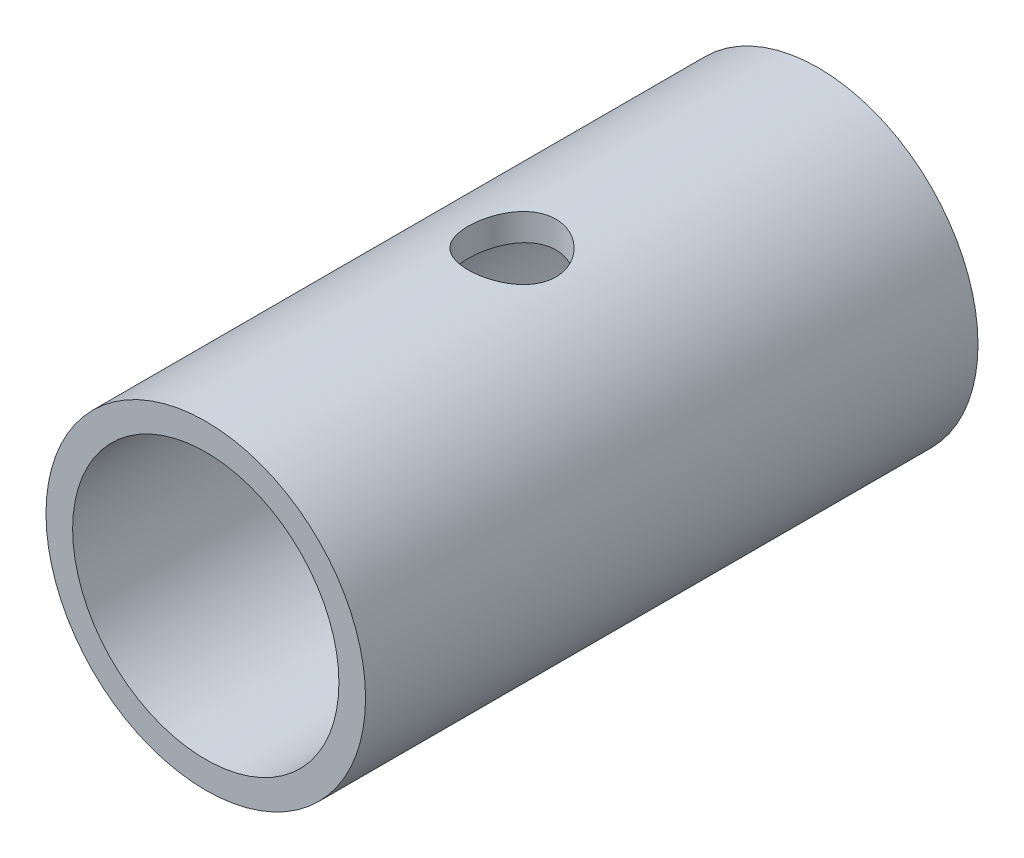
ISO-10303-21;
HEADER;
FILE_DESCRIPTION(('STEP AP214'),'2;1');
FILE_NAME('part.step','',(''),(''),'','','');
FILE_SCHEMA(('AUTOMOTIVE_DESIGN { 1 0 10303 214 1 1 1 1 }'));
ENDSEC;
DATA;
#1=APPLICATION_CONTEXT('core data for automotive mechanical design processes');
#2=APPLICATION_PROTOCOL_DEFINITION('international standard','automotive_design',2000,#1);
#3=PRODUCT_CONTEXT('',#1,'mechanical');
#4=PRODUCT('Part','Part','',(#3));
#5=PRODUCT_RELATED_PRODUCT_CATEGORY('part','',(#4));
#6=PRODUCT_DEFINITION_FORMATION('','',#4);
#7=PRODUCT_DEFINITION_CONTEXT('part definition',#1,'design');
#8=PRODUCT_DEFINITION('design','',#6,#7);
#9=PRODUCT_DEFINITION_SHAPE('','',#8);
#10=(LENGTH_UNIT() NAMED_UNIT(*) SI_UNIT(.MILLI.,.METRE.));
#11=(NAMED_UNIT(*) PLANE_ANGLE_UNIT() SI_UNIT($,.RADIAN.));
#12=(NAMED_UNIT(*) SI_UNIT($,.STERADIAN.) SOLID_ANGLE_UNIT());
#13=UNCERTAINTY_MEASURE_WITH_UNIT(LENGTH_MEASURE(1.E-05),#10,'distance_accuracy_value','');
#14=(GEOMETRIC_REPRESENTATION_CONTEXT(3) GLOBAL_UNCERTAINTY_ASSIGNED_CONTEXT((#13)) GLOBAL_UNIT_ASSIGNED_CONTEXT((#10,
#11,#12)) REPRESENTATION_CONTEXT('',''));
#15=CARTESIAN_POINT('',(0.,0.,0.));
#16=DIRECTION('',(0.,0.,1.));
#17=DIRECTION('',(1.,0.,0.));
#18=AXIS2_PLACEMENT_3D('',#15,#16,#17);
#19=CARTESIAN_POINT('',(0.,0.,11.5));
#20=DIRECTION('',(0.,0.,1.));
#21=DIRECTION('',(1.,0.,0.));
#22=AXIS2_PLACEMENT_3D('',#19,#20,#21);
#23=PLANE('',#22);
#24=CARTESIAN_POINT('',(0.,0.,11.5));
#25=DIRECTION('',(0.,0.,1.));
#26=DIRECTION('',(1.,0.,0.));
#27=AXIS2_PLACEMENT_3D('',#24,#25,#26);
#28=CIRCLE('',#27,6.);
#29=CARTESIAN_POINT('',(6.,0.,11.5));
#30=VERTEX_POINT('',#29);
#31=EDGE_CURVE('E10',#30,#30,#28,.T.);
#32=ORIENTED_EDGE('',*,*,#31,.T.);
#33=EDGE_LOOP('',(#32));
#34=FACE_BOUND('',#33,.T.);
#35=CARTESIAN_POINT('',(0.,0.,11.5));
#36=DIRECTION('',(0.,0.,1.));
#37=DIRECTION('',(1.,0.,0.));
#38=AXIS2_PLACEMENT_3D('',#35,#36,#37);
#39=CIRCLE('',#38,5.);
#40=CARTESIAN_POINT('',(5.,0.,11.5));
#41=VERTEX_POINT('',#40);
#42=EDGE_CURVE('E45',#41,#41,#39,.T.);
#43=ORIENTED_EDGE('',*,*,#42,.F.);
#44=EDGE_LOOP('',(#43));
#45=FACE_BOUND('',#44,.T.);
#46=ADVANCED_FACE('F34',(#34,#45),#23,.T.);
#47=CARTESIAN_POINT('',(0.,0.,-11.5));
#48=DIRECTION('',(0.,0.,1.));
#49=DIRECTION('',(1.,0.,0.));
#50=AXIS2_PLACEMENT_3D('',#47,#48,#49);
#51=PLANE('',#50);
#52=CARTESIAN_POINT('',(0.,0.,-11.5));
#53=DIRECTION('',(0.,0.,1.));
#54=DIRECTION('',(1.,0.,0.));
#55=AXIS2_PLACEMENT_3D('',#52,#53,#54);
#56=CIRCLE('',#55,6.);
#57=CARTESIAN_POINT('',(6.,0.,-11.5));
#58=VERTEX_POINT('',#57);
#59=EDGE_CURVE('E38',#58,#58,#56,.T.);
#60=ORIENTED_EDGE('',*,*,#59,.F.);
#61=EDGE_LOOP('',(#60));
#62=FACE_BOUND('',#61,.T.);
#63=CARTESIAN_POINT('',(0.,0.,-11.5));
#64=DIRECTION('',(0.,0.,1.));
#65=DIRECTION('',(1.,0.,0.));
#66=AXIS2_PLACEMENT_3D('',#63,#64,#65);
#67=CIRCLE('',#66,5.);
#68=CARTESIAN_POINT('',(5.,0.,-11.5));
#69=VERTEX_POINT('',#68);
#70=EDGE_CURVE('E47',#69,#69,#67,.T.);
#71=ORIENTED_EDGE('',*,*,#70,.T.);
#72=EDGE_LOOP('',(#71));
#73=FACE_BOUND('',#72,.T.);
#74=ADVANCED_FACE('F78',(#62,#73),#51,.F.);
#75=CARTESIAN_POINT('',(0.,0.,11.5));
#76=DIRECTION('',(0.,0.,-1.));
#77=DIRECTION('',(-1.,0.,0.));
#78=AXIS2_PLACEMENT_3D('',#75,#76,#77);
#79=CYLINDRICAL_SURFACE('',#78,6.);
#80=CARTESIAN_POINT('',(0.,6.,1.65));
#81=CARTESIAN_POINT('',(0.090853728327696,5.99999874308259,1.64999807099645));
#82=CARTESIAN_POINT('',(0.181727733575568,5.99791622790463,1.64247089912752));
#83=CARTESIAN_POINT('',(0.360851012556402,5.98981117624032,1.61261870180666));
#84=CARTESIAN_POINT('',(0.449099121993647,5.98378691845858,1.59028721149158));
#85=CARTESIAN_POINT('',(0.620359675500261,5.96846215356675,1.5316125135351));
#86=CARTESIAN_POINT('',(0.703378936424506,5.95916602079348,1.49528800777301));
#87=CARTESIAN_POINT('',(0.862147532275073,5.9382760100701,1.40972952683832));
#88=CARTESIAN_POINT('',(0.937896261330002,5.92668194087358,1.36049447707183));
#89=CARTESIAN_POINT('',(1.08183136781088,5.90212624569014,1.2492381199734));
#90=CARTESIAN_POINT('',(1.14981405351217,5.88914009329631,1.18695870420413));
#91=CARTESIAN_POINT('',(1.27451362220699,5.86341857808967,1.05193283429949));
#92=CARTESIAN_POINT('',(1.33122895521962,5.85068324999801,0.979184942450014));
#93=CARTESIAN_POINT('',(1.43279568288042,5.82665244921014,0.823638002819942));
#94=CARTESIAN_POINT('',(1.47740934109683,5.81538781414375,0.740678517304746));
#95=CARTESIAN_POINT('',(1.55197373568299,5.79593589094513,0.568075919513222));
#96=CARTESIAN_POINT('',(1.58192736761612,5.78774799518745,0.478434131120398));
#97=CARTESIAN_POINT('',(1.62560750003859,5.7756304093822,0.297275336240546));
#98=CARTESIAN_POINT('',(1.63970484886952,5.77160359132479,0.205854405766726));
#99=CARTESIAN_POINT('',(1.65242890666582,5.76797418839314,0.0218632638827159));
#100=CARTESIAN_POINT('',(1.65105870633264,5.76837071965198,-0.0707067142339519));
#101=CARTESIAN_POINT('',(1.63318021863208,5.77345648215431,-0.251445448718453));
#102=CARTESIAN_POINT('',(1.61712435820282,5.77801741181752,-0.339663148670662));
#103=CARTESIAN_POINT('',(1.57105645702899,5.79071212543296,-0.5121015428571));
#104=CARTESIAN_POINT('',(1.54104323793963,5.79884621104432,-0.596321898955338));
#105=CARTESIAN_POINT('',(1.46755257403608,5.8178810068791,-0.759536646499854));
#106=CARTESIAN_POINT('',(1.42391940277051,5.82881343808644,-0.838457062932246));
#107=CARTESIAN_POINT('',(1.32453594216562,5.8521965018176,-0.988013089670044));
#108=CARTESIAN_POINT('',(1.26878313205863,5.86464744994142,-1.05864697174372));
#109=CARTESIAN_POINT('',(1.14444557863618,5.89019543667637,-1.19220548799731));
#110=CARTESIAN_POINT('',(1.07548193780207,5.90329988395932,-1.25477649008794));
#111=CARTESIAN_POINT('',(0.927879174135835,5.92829105959038,-1.36754009171226));
#112=CARTESIAN_POINT('',(0.849239620758374,5.94017773370855,-1.41773214012565));
#113=CARTESIAN_POINT('',(0.683947027422496,5.96147504122309,-1.50448258165223));
#114=CARTESIAN_POINT('',(0.597256901414118,5.97087336103955,-1.54097353369754));
#115=CARTESIAN_POINT('',(0.418654132043705,5.98604617450553,-1.59875969929591));
#116=CARTESIAN_POINT('',(0.326742710235057,5.9918215119967,-1.62005845147649));
#117=CARTESIAN_POINT('',(0.143321506269139,5.99896860669685,-1.64629239149309));
#118=CARTESIAN_POINT('',(0.0518853661978224,6.00046960488126,-1.65170798633319));
#119=CARTESIAN_POINT('',(-0.13058988459751,5.99927229231555,-1.64735333458747));
#120=CARTESIAN_POINT('',(-0.221629038059,5.9965744453723,-1.63758476525333));
#121=CARTESIAN_POINT('',(-0.398987770207998,5.98736635921293,-1.60353193851751));
#122=CARTESIAN_POINT('',(-0.485363423879031,5.98092734475059,-1.57951869821485));
#123=CARTESIAN_POINT('',(-0.652849667611911,5.96497031766694,-1.51797560507925));
#124=CARTESIAN_POINT('',(-0.733959668311753,5.95545196109898,-1.48044424228852));
#125=CARTESIAN_POINT('',(-0.890455295917684,5.93409297712807,-1.39205978335043));
#126=CARTESIAN_POINT('',(-0.965689503643772,5.92220874688328,-1.34094938630763));
#127=CARTESIAN_POINT('',(-1.1066809671127,5.89749009177705,-1.2271784596786));
#128=CARTESIAN_POINT('',(-1.17243622308682,5.88465546727348,-1.16451549919106));
#129=CARTESIAN_POINT('',(-1.29465015721015,5.85900191245662,-1.02717154749665));
#130=CARTESIAN_POINT('',(-1.35076903800646,5.84619510636324,-0.952185340929553));
#131=CARTESIAN_POINT('',(-1.44963820489912,5.82246888214058,-0.793586486663871));
#132=CARTESIAN_POINT('',(-1.49238901579837,5.81154938992678,-0.709974177779731));
#133=CARTESIAN_POINT('',(-1.56298916810733,5.79296111659894,-0.536887669815469));
#134=CARTESIAN_POINT('',(-1.59092227269253,5.78527411484172,-0.447449701169388));
#135=CARTESIAN_POINT('',(-1.63127619202049,5.77402677636451,-0.264896462537506));
#136=CARTESIAN_POINT('',(-1.64370128166884,5.77046530242998,-0.171782213251764));
#137=CARTESIAN_POINT('',(-1.65242931750206,5.76797147491958,0.0119898828132407));
#138=CARTESIAN_POINT('',(-1.64928014369359,5.76888180213839,0.102619950855172));
#139=CARTESIAN_POINT('',(-1.62822879843177,5.77485828369776,0.282003416000701));
#140=CARTESIAN_POINT('',(-1.61032705344815,5.77992431790445,0.370756867277771));
#141=CARTESIAN_POINT('',(-1.56060549557288,5.7935447800639,0.543128977348241));
#142=CARTESIAN_POINT('',(-1.52890872620598,5.80206832439478,0.626785742657211));
#143=CARTESIAN_POINT('',(-1.45259209961126,5.82164247853969,0.78765860998809));
#144=CARTESIAN_POINT('',(-1.40797010013714,5.83269350719869,0.864873641613058));
#145=CARTESIAN_POINT('',(-1.30543867870844,5.856507274906,1.01326917305464));
#146=CARTESIAN_POINT('',(-1.24715873005677,5.8693126029988,1.08418685503001));
#147=CARTESIAN_POINT('',(-1.11966133853961,5.89496224754912,1.21541371112339));
#148=CARTESIAN_POINT('',(-1.05044120164629,5.9078065728436,1.27572026449428));
#149=CARTESIAN_POINT('',(-0.901092250249274,5.93244341761611,1.38539259257944));
#150=CARTESIAN_POINT('',(-0.820747709123238,5.94420464277088,1.43447225610964));
#151=CARTESIAN_POINT('',(-0.652625872638596,5.96500063379118,1.5183518667129));
#152=CARTESIAN_POINT('',(-0.564853084925043,5.97403703816731,1.55316039996172));
#153=CARTESIAN_POINT('',(-0.397919658743002,5.98728597467613,1.60330363251498));
#154=CARTESIAN_POINT('',(-0.319434916548891,5.99201791048024,1.62077254795141));
#155=CARTESIAN_POINT('',(-0.160638594873061,5.99837530343306,1.64412093024872));
#156=CARTESIAN_POINT('',(-0.0803272226686441,6.00000111128829,1.65000170550511));
#157=CARTESIAN_POINT('',(0.,6.,1.65));
#158=B_SPLINE_CURVE_WITH_KNOTS('',3,(#80,#81,#82,#83,#84,#85,#86,#87,#88,#89,#90,#91,#92,#93,
#94,#95,#96,#97,#98,#99,#100,#101,#102,#103,#104,#105,#106,#107,#108,#109,#110,#111,#112,#113,
#114,#115,#116,#117,#118,#119,#120,#121,#122,#123,#124,#125,#126,#127,#128,#129,#130,#131,#132,
#133,#134,#135,#136,#137,#138,#139,#140,#141,#142,#143,#144,#145,#146,#147,#148,#149,#150,#151,
#152,#153,#154,#155,#156,#157),.UNSPECIFIED.,.T.,.F.,(4,2,2,2,2,2,2,2,2,2,2,2,2,2,2,2,2,2,2,2,2,
2,2,2,2,2,2,2,2,2,2,2,2,2,2,2,2,2,4),(0.,0.272266491235062,0.544651956274203,0.816674629991575,
1.08871995238569,1.36676668474294,1.64485163984642,1.92805811024662,2.21120862075008,
2.48758935156345,2.76391485738987,3.03200413559448,3.30011605124618,3.57141329094733,
3.84276701193229,4.12355975427328,4.4043649954619,4.68653487032465,4.96863899957848,
5.24211776230094,5.51556631854553,5.78397200237263,6.05240767608969,6.32634577802897,
6.60034158820947,6.88259284524954,7.16483302029487,7.44546024030154,7.72601008612323,
7.99676228549106,8.26750665818486,8.5358841136017,8.80430607576226,9.08108736952955,
9.3579369273538,9.64120588287105,9.92430415962331,10.1650524617278,10.4057735798283),.UNSPECIFIED.);
#159=CARTESIAN_POINT('',(0.,6.,1.65));
#160=VERTEX_POINT('',#159);
#161=EDGE_CURVE('E60',#160,#160,#158,.T.);
#162=ORIENTED_EDGE('',*,*,#161,.F.);
#163=EDGE_LOOP('',(#162));
#164=FACE_BOUND('',#163,.T.);
#165=ORIENTED_EDGE('',*,*,#31,.F.);
#166=EDGE_LOOP('',(#165));
#167=FACE_BOUND('',#166,.T.);
#168=ORIENTED_EDGE('',*,*,#59,.T.);
#169=EDGE_LOOP('',(#168));
#170=FACE_BOUND('',#169,.T.);
#171=ADVANCED_FACE('F36',(#164,#167,#170),#79,.T.);
#172=CARTESIAN_POINT('',(0.,0.,11.5));
#173=DIRECTION('',(0.,0.,-1.));
#174=DIRECTION('',(-1.,0.,0.));
#175=AXIS2_PLACEMENT_3D('',#172,#173,#174);
#176=CYLINDRICAL_SURFACE('',#175,5.);
#177=CARTESIAN_POINT('',(0.,5.,1.65));
#178=CARTESIAN_POINT('',(0.0900803323989869,5.00000012564882,1.65000024251439));
#179=CARTESIAN_POINT('',(0.180159574077353,4.99754312617873,1.64259916251505));
#180=CARTESIAN_POINT('',(0.357667875169258,4.98798348171152,1.61327885047237));
#181=CARTESIAN_POINT('',(0.445096605656321,4.98088026257134,1.59135782416472));
#182=CARTESIAN_POINT('',(0.614719075952394,4.962800681432,1.53382868761172));
#183=CARTESIAN_POINT('',(0.696921201899966,4.95183071876684,1.49824318298597));
#184=CARTESIAN_POINT('',(0.854190645874484,4.92713947248839,1.41449642730815));
#185=CARTESIAN_POINT('',(0.929256597076055,4.91341766335966,1.36633277369658));
#186=CARTESIAN_POINT('',(1.07267700256014,4.88414667976014,1.25707517692859));
#187=CARTESIAN_POINT('',(1.140755021368,4.86855436886587,1.19562998172584));
#188=CARTESIAN_POINT('',(1.26585047260417,4.83753907804007,1.06230048608017));
#189=CARTESIAN_POINT('',(1.32286553369749,4.8221161350793,0.990413953307288));
#190=CARTESIAN_POINT('',(1.42578155512387,4.79271313173333,0.835769387620551));
#191=CARTESIAN_POINT('',(1.47132547146369,4.77878574898835,0.752762762414838));
#192=CARTESIAN_POINT('',(1.54768950007051,4.75460549483772,0.579734369165922));
#193=CARTESIAN_POINT('',(1.57851400356116,4.74435152777496,0.489714702647668));
#194=CARTESIAN_POINT('',(1.62353134991424,4.72913282635101,0.308355170918738));
#195=CARTESIAN_POINT('',(1.6382413417332,4.72400412235766,0.217157836674355));
#196=CARTESIAN_POINT('',(1.65222861163856,4.7191313464795,0.0334563873059888));
#197=CARTESIAN_POINT('',(1.65151054662635,4.71938564975367,-0.0590473250677414));
#198=CARTESIAN_POINT('',(1.63506410098719,4.72510629107568,-0.238347202392314));
#199=CARTESIAN_POINT('',(1.62000769651633,4.73033928879681,-0.325213735238814));
#200=CARTESIAN_POINT('',(1.57640708934977,4.74504632523487,-0.495110906166728));
#201=CARTESIAN_POINT('',(1.54786130181506,4.75452086227438,-0.578141092265257));
#202=CARTESIAN_POINT('',(1.47764674240873,4.77681173941,-0.739547439994636));
#203=CARTESIAN_POINT('',(1.43577693123636,4.78967871947683,-0.817828850225322));
#204=CARTESIAN_POINT('',(1.34024242388315,4.81728315916032,-0.966468362301521));
#205=CARTESIAN_POINT('',(1.28657437554158,4.8320211498719,-1.03682420369406));
#206=CARTESIAN_POINT('',(1.16572801734404,4.86262798242566,-1.17139522741021));
#207=CARTESIAN_POINT('',(1.09799945388895,4.87851612594017,-1.23511287864314));
#208=CARTESIAN_POINT('',(0.952622363558089,4.9089733458653,-1.3504141782392));
#209=CARTESIAN_POINT('',(0.874972923819722,4.92354230068063,-1.40199670875499));
#210=CARTESIAN_POINT('',(0.710918878360197,4.94990429259939,-1.49195351683702));
#211=CARTESIAN_POINT('',(0.624437715003009,4.96166947936115,-1.53019689721305));
#212=CARTESIAN_POINT('',(0.445788820584338,4.98089634514734,-1.5914397196063));
#213=CARTESIAN_POINT('',(0.353623035566636,4.98835948795835,-1.61444434706413));
#214=CARTESIAN_POINT('',(0.17043493694281,4.9979000192954,-1.64368078538326));
#215=CARTESIAN_POINT('',(0.0795310449403317,5.00019320840939,-1.65058509363946));
#216=CARTESIAN_POINT('',(-0.102152997074191,4.99978120399321,-1.64933736730874));
#217=CARTESIAN_POINT('',(-0.19293316503069,4.99707683523427,-1.64118781713324));
#218=CARTESIAN_POINT('',(-0.369117276094977,4.98711592890817,-1.61059717381709));
#219=CARTESIAN_POINT('',(-0.454600657078434,4.97999029806496,-1.58856678998547));
#220=CARTESIAN_POINT('',(-0.620625393385988,4.9620361021664,-1.53135130848825));
#221=CARTESIAN_POINT('',(-0.701166119538833,4.9512070668376,-1.49616454011811));
#222=CARTESIAN_POINT('',(-0.857353583850657,4.92659738190256,-1.41261898044764));
#223=CARTESIAN_POINT('',(-0.932818538636809,4.91274728599483,-1.36394138523551));
#224=CARTESIAN_POINT('',(-1.07472879779133,4.8836680633903,-1.25517176520409));
#225=CARTESIAN_POINT('',(-1.14117138619964,4.86843852373584,-1.19507631632604));
#226=CARTESIAN_POINT('',(-1.26622547851877,4.83745909847491,-1.06201382730805));
#227=CARTESIAN_POINT('',(-1.32435715949936,4.82171620160002,-0.988593133076303));
#228=CARTESIAN_POINT('',(-1.42753142742357,4.79218567046632,-0.832700145106317));
#229=CARTESIAN_POINT('',(-1.47257396443646,4.77839804366632,-0.750227816840762));
#230=CARTESIAN_POINT('',(-1.54806908435208,4.75447746870333,-0.578574516041669));
#231=CARTESIAN_POINT('',(-1.57855621066785,4.74433588191365,-0.489410014022785));
#232=CARTESIAN_POINT('',(-1.62395003915296,4.728992662468,-0.306802097920406));
#233=CARTESIAN_POINT('',(-1.6388635764124,4.72378886275909,-0.213360579787975));
#234=CARTESIAN_POINT('',(-1.65216049477084,4.71915352744857,-0.0299145750870902));
#235=CARTESIAN_POINT('',(-1.65133872365081,4.71944442417866,0.060025936378169));
#236=CARTESIAN_POINT('',(-1.63513842564514,4.72508139490563,0.238416599590154));
#237=CARTESIAN_POINT('',(-1.61976073262756,4.73042717932209,0.326866836415121));
#238=CARTESIAN_POINT('',(-1.57544291875232,4.74536693764461,0.498164137184589));
#239=CARTESIAN_POINT('',(-1.5467552709297,4.75488165289364,0.581083972157469));
#240=CARTESIAN_POINT('',(-1.47683540940046,4.77705935615133,0.740997492662576));
#241=CARTESIAN_POINT('',(-1.43560044678477,4.78972303393433,0.817989874951906));
#242=CARTESIAN_POINT('',(-1.33969084183066,4.81744939348764,0.967443454366387));
#243=CARTESIAN_POINT('',(-1.28451538865982,4.83259170443489,1.03956841106977));
#244=CARTESIAN_POINT('',(-1.16314331347536,4.86323043063064,1.17379258067502));
#245=CARTESIAN_POINT('',(-1.09694360376003,4.87872694403302,1.23588897512673));
#246=CARTESIAN_POINT('',(-0.95238767673411,4.90903317548773,1.35066333180926));
#247=CARTESIAN_POINT('',(-0.873665758138174,4.92379458911327,1.40289502168525));
#248=CARTESIAN_POINT('',(-0.708077082051271,4.95031750248797,1.49332485789776));
#249=CARTESIAN_POINT('',(-0.621212604024482,4.96207983840249,1.53152691711138));
#250=CARTESIAN_POINT('',(-0.446386541872213,4.98076953032462,1.59101301503053));
#251=CARTESIAN_POINT('',(-0.358709155083952,4.98791371763214,1.61306352248398));
#252=CARTESIAN_POINT('',(-0.180687007883427,4.99752827480817,1.6425549720432));
#253=CARTESIAN_POINT('',(-0.0903429553968472,4.99999987398486,1.64999975677857));
#254=CARTESIAN_POINT('',(0.,5.,1.65));
#255=B_SPLINE_CURVE_WITH_KNOTS('',3,(#177,#178,#179,#180,#181,#182,#183,#184,#185,#186,#187,
#188,#189,#190,#191,#192,#193,#194,#195,#196,#197,#198,#199,#200,#201,#202,#203,#204,#205,#206,
#207,#208,#209,#210,#211,#212,#213,#214,#215,#216,#217,#218,#219,#220,#221,#222,#223,#224,#225,
#226,#227,#228,#229,#230,#231,#232,#233,#234,#235,#236,#237,#238,#239,#240,#241,#242,#243,#244,
#245,#246,#247,#248,#249,#250,#251,#252,#253,#254),.UNSPECIFIED.,.T.,.F.,(4,2,2,2,2,2,2,2,2,2,2,
2,2,2,2,2,2,2,2,2,2,2,2,2,2,2,2,2,2,2,2,2,2,2,2,2,2,2,4),(0.,0.2699086041325,0.539850567737247,
0.809347867689094,1.07889668217443,1.35671215765951,1.63458711701568,1.92026489148117,
2.20585738673402,2.48198869358467,2.75803665240173,3.02175295330504,3.28550024538373,
3.55343249441286,3.82144096800204,4.10314526837295,4.38487550826387,4.66929734218009,
4.95362234329175,5.22584041060147,5.49801355645393,5.76248915124948,6.02699834271655,
6.29838751507405,6.56985820217368,6.85340472718154,7.13695233381086,7.41982362841787,
7.70257072144072,7.9710746862461,8.23956327014096,8.50315503612411,8.76680459233092,
9.04176838412562,9.31680931840238,9.60227659952698,9.88766420298746,10.1584309528124,
10.4291264568694),.UNSPECIFIED.);
#256=CARTESIAN_POINT('',(0.,5.,1.65));
#257=VERTEX_POINT('',#256);
#258=EDGE_CURVE('E50',#257,#257,#255,.T.);
#259=ORIENTED_EDGE('',*,*,#258,.T.);
#260=EDGE_LOOP('',(#259));
#261=FACE_BOUND('',#260,.T.);
#262=ORIENTED_EDGE('',*,*,#42,.T.);
#263=EDGE_LOOP('',(#262));
#264=FACE_BOUND('',#263,.T.);
#265=ORIENTED_EDGE('',*,*,#70,.F.);
#266=EDGE_LOOP('',(#265));
#267=FACE_BOUND('',#266,.T.);
#268=ADVANCED_FACE('F71',(#261,#264,#267),#176,.F.);
#269=CARTESIAN_POINT('',(0.,-6.001,0.));
#270=DIRECTION('',(0.,1.,0.));
#271=DIRECTION('',(0.,0.,1.));
#272=AXIS2_PLACEMENT_3D('',#269,#270,#271);
#273=CYLINDRICAL_SURFACE('',#272,1.65);
#274=ORIENTED_EDGE('',*,*,#258,.F.);
#275=EDGE_LOOP('',(#274));
#276=FACE_BOUND('',#275,.T.);
#277=ORIENTED_EDGE('',*,*,#161,.T.);
#278=EDGE_LOOP('',(#277));
#279=FACE_BOUND('',#278,.T.);
#280=ADVANCED_FACE('F65',(#276,#279),#273,.F.);
#281=CLOSED_SHELL('',(#46,#74,#171,#268,#280));
#282=MANIFOLD_SOLID_BREP('B2',#281);
#283=ADVANCED_BREP_SHAPE_REPRESENTATION('',(#18,#282),#14);
#284=SHAPE_DEFINITION_REPRESENTATION(#9,#283);
ENDSEC;
END-ISO-10303-21;
